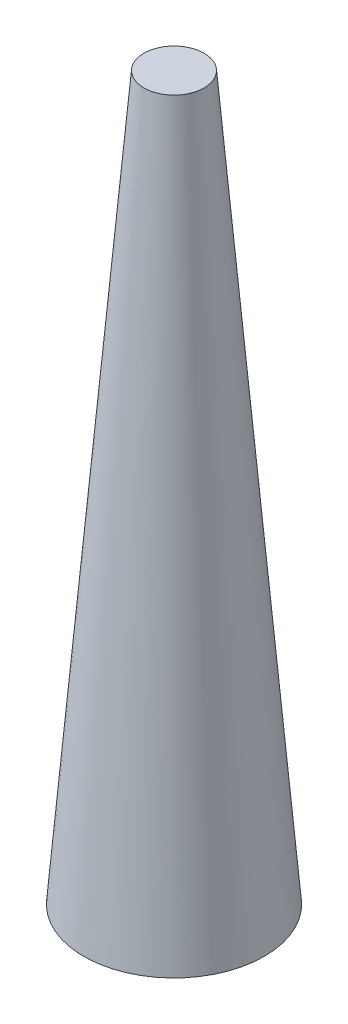
ISO-10303-21;
HEADER;
FILE_DESCRIPTION(('STEP AP214'),'2;1');
FILE_NAME('part.step','',(''),(''),'','','');
FILE_SCHEMA(('AUTOMOTIVE_DESIGN { 1 0 10303 214 1 1 1 1 }'));
ENDSEC;
DATA;
#1=APPLICATION_CONTEXT('core data for automotive mechanical design processes');
#2=APPLICATION_PROTOCOL_DEFINITION('international standard','automotive_design',2000,#1);
#3=PRODUCT_CONTEXT('',#1,'mechanical');
#4=PRODUCT('Part','Part','',(#3));
#5=PRODUCT_RELATED_PRODUCT_CATEGORY('part','',(#4));
#6=PRODUCT_DEFINITION_FORMATION('','',#4);
#7=PRODUCT_DEFINITION_CONTEXT('part definition',#1,'design');
#8=PRODUCT_DEFINITION('design','',#6,#7);
#9=PRODUCT_DEFINITION_SHAPE('','',#8);
#10=(LENGTH_UNIT() NAMED_UNIT(*) SI_UNIT(.MILLI.,.METRE.));
#11=(NAMED_UNIT(*) PLANE_ANGLE_UNIT() SI_UNIT($,.RADIAN.));
#12=(NAMED_UNIT(*) SI_UNIT($,.STERADIAN.) SOLID_ANGLE_UNIT());
#13=UNCERTAINTY_MEASURE_WITH_UNIT(LENGTH_MEASURE(1.E-05),#10,'distance_accuracy_value','');
#14=(GEOMETRIC_REPRESENTATION_CONTEXT(3) GLOBAL_UNCERTAINTY_ASSIGNED_CONTEXT((#13)) GLOBAL_UNIT_ASSIGNED_CONTEXT((#10,
#11,#12)) REPRESENTATION_CONTEXT('',''));
#15=CARTESIAN_POINT('',(0.,0.,0.));
#16=DIRECTION('',(0.,0.,1.));
#17=DIRECTION('',(1.,0.,0.));
#18=AXIS2_PLACEMENT_3D('',#15,#16,#17);
#19=CARTESIAN_POINT('',(0.,0.,0.));
#20=DIRECTION('',(0.,-1.,0.));
#21=DIRECTION('',(1.,0.,0.));
#22=AXIS2_PLACEMENT_3D('',#19,#20,#21);
#23=PLANE('',#22);
#24=CARTESIAN_POINT('',(0.,0.,0.));
#25=DIRECTION('',(0.,1.,0.));
#26=DIRECTION('',(-1.,0.,0.));
#27=AXIS2_PLACEMENT_3D('',#24,#25,#26);
#28=CIRCLE('',#27,19.05);
#29=CARTESIAN_POINT('',(19.05,0.,0.));
#30=VERTEX_POINT('',#29);
#31=EDGE_CURVE('E10',#30,#30,#28,.T.);
#32=ORIENTED_EDGE('',*,*,#31,.F.);
#33=EDGE_LOOP('',(#32));
#34=FACE_BOUND('',#33,.T.);
#35=ADVANCED_FACE('F43',(#34),#23,.T.);
#36=CARTESIAN_POINT('',(0.,152.4,0.));
#37=DIRECTION('',(0.,-1.,0.));
#38=DIRECTION('',(1.,0.,0.));
#39=AXIS2_PLACEMENT_3D('',#36,#37,#38);
#40=CONICAL_SURFACE('',#39,6.35,0.0831412318884412);
#41=CARTESIAN_POINT('',(0.,152.4,0.));
#42=DIRECTION('',(0.,1.,0.));
#43=DIRECTION('',(-1.,0.,0.));
#44=AXIS2_PLACEMENT_3D('',#41,#42,#43);
#45=CIRCLE('',#44,6.35);
#46=CARTESIAN_POINT('',(6.34999999999999,152.4,0.));
#47=VERTEX_POINT('',#46);
#48=EDGE_CURVE('E50',#47,#47,#45,.T.);
#49=CARTESIAN_POINT('',(19.05,0.,0.));
#50=CARTESIAN_POINT('',(18.9177083333333,1.58750000000003,0.));
#51=CARTESIAN_POINT('',(18.7854166666667,3.17500000000003,0.));
#52=CARTESIAN_POINT('',(18.5208333333333,6.35000000000003,0.));
#53=CARTESIAN_POINT('',(18.3885416666667,7.93750000000003,0.));
#54=CARTESIAN_POINT('',(18.1239583333333,11.1125,0.));
#55=CARTESIAN_POINT('',(17.9916666666667,12.7,0.));
#56=CARTESIAN_POINT('',(17.7270833333333,15.875,0.));
#57=CARTESIAN_POINT('',(17.5947916666667,17.4625,0.));
#58=CARTESIAN_POINT('',(17.3302083333333,20.6375,0.));
#59=CARTESIAN_POINT('',(17.1979166666667,22.225,0.));
#60=CARTESIAN_POINT('',(16.9333333333333,25.4,0.));
#61=CARTESIAN_POINT('',(16.8010416666667,26.9875,0.));
#62=CARTESIAN_POINT('',(16.5364583333333,30.1625,0.));
#63=CARTESIAN_POINT('',(16.4041666666667,31.75,0.));
#64=CARTESIAN_POINT('',(16.1395833333333,34.925,0.));
#65=CARTESIAN_POINT('',(16.0072916666667,36.5125,0.));
#66=CARTESIAN_POINT('',(15.7427083333333,39.6875,0.));
#67=CARTESIAN_POINT('',(15.6104166666667,41.275,0.));
#68=CARTESIAN_POINT('',(15.3458333333333,44.45,0.));
#69=CARTESIAN_POINT('',(15.2135416666667,46.0375,0.));
#70=CARTESIAN_POINT('',(14.9489583333333,49.2125,0.));
#71=CARTESIAN_POINT('',(14.8166666666667,50.8,0.));
#72=CARTESIAN_POINT('',(14.5520833333333,53.975,0.));
#73=CARTESIAN_POINT('',(14.4197916666667,55.5625,0.));
#74=CARTESIAN_POINT('',(14.1552083333333,58.7375,0.));
#75=CARTESIAN_POINT('',(14.0229166666667,60.325,0.));
#76=CARTESIAN_POINT('',(13.7583333333333,63.5,0.));
#77=CARTESIAN_POINT('',(13.6260416666667,65.0875,0.));
#78=CARTESIAN_POINT('',(13.3614583333333,68.2625,0.));
#79=CARTESIAN_POINT('',(13.2291666666667,69.85,0.));
#80=CARTESIAN_POINT('',(12.9645833333333,73.025,0.));
#81=CARTESIAN_POINT('',(12.8322916666667,74.6125,0.));
#82=CARTESIAN_POINT('',(12.5677083333333,77.7875,0.));
#83=CARTESIAN_POINT('',(12.4354166666667,79.375,0.));
#84=CARTESIAN_POINT('',(12.1708333333333,82.55,0.));
#85=CARTESIAN_POINT('',(12.0385416666667,84.1375,0.));
#86=CARTESIAN_POINT('',(11.7739583333333,87.3125,0.));
#87=CARTESIAN_POINT('',(11.6416666666667,88.9,0.));
#88=CARTESIAN_POINT('',(11.3770833333333,92.075,0.));
#89=CARTESIAN_POINT('',(11.2447916666667,93.6625,0.));
#90=CARTESIAN_POINT('',(10.9802083333333,96.8375,0.));
#91=CARTESIAN_POINT('',(10.8479166666667,98.425,0.));
#92=CARTESIAN_POINT('',(10.5833333333333,101.6,0.));
#93=CARTESIAN_POINT('',(10.4510416666667,103.1875,0.));
#94=CARTESIAN_POINT('',(10.1864583333333,106.3625,0.));
#95=CARTESIAN_POINT('',(10.0541666666667,107.95,0.));
#96=CARTESIAN_POINT('',(9.78958333333333,111.125,0.));
#97=CARTESIAN_POINT('',(9.65729166666666,112.7125,0.));
#98=CARTESIAN_POINT('',(9.39270833333333,115.8875,0.));
#99=CARTESIAN_POINT('',(9.26041666666666,117.475,0.));
#100=CARTESIAN_POINT('',(8.99583333333333,120.65,0.));
#101=CARTESIAN_POINT('',(8.86354166666666,122.2375,0.));
#102=CARTESIAN_POINT('',(8.59895833333333,125.4125,0.));
#103=CARTESIAN_POINT('',(8.46666666666666,127.,0.));
#104=CARTESIAN_POINT('',(8.20208333333333,130.175,0.));
#105=CARTESIAN_POINT('',(8.06979166666666,131.7625,0.));
#106=CARTESIAN_POINT('',(7.80520833333333,134.9375,0.));
#107=CARTESIAN_POINT('',(7.67291666666666,136.525,0.));
#108=CARTESIAN_POINT('',(7.40833333333333,139.7,0.));
#109=CARTESIAN_POINT('',(7.27604166666666,141.2875,0.));
#110=CARTESIAN_POINT('',(7.01145833333333,144.4625,0.));
#111=CARTESIAN_POINT('',(6.87916666666666,146.05,0.));
#112=CARTESIAN_POINT('',(6.61458333333333,149.225,0.));
#113=CARTESIAN_POINT('',(6.48229166666666,150.8125,0.));
#114=CARTESIAN_POINT('',(6.34999999999999,152.4,0.));
#115=B_SPLINE_CURVE_WITH_KNOTS('',3,(#49,#50,#51,#52,#53,#54,#55,#56,#57,#58,#59,#60,#61,#62,
#63,#64,#65,#66,#67,#68,#69,#70,#71,#72,#73,#74,#75,#76,#77,#78,#79,#80,#81,#82,#83,#84,#85,#86,
#87,#88,#89,#90,#91,#92,#93,#94,#95,#96,#97,#98,#99,#100,#101,#102,#103,#104,#105,#106,#107,
#108,#109,#110,#111,#112,#113,#114),.UNSPECIFIED.,.F.,.F.,(4,2,2,2,2,2,2,2,2,2,2,2,2,2,2,2,2,2,
2,2,2,2,2,2,2,2,2,2,2,2,2,2,4),(0.,4.7790078484582,9.55801569691639,14.3370235453746,
19.1160313938328,23.8950392422909,28.6740470907491,33.4530549392073,38.2320627876655,
43.0110706361237,47.7900784845819,52.5690863330401,57.3480941814983,62.1271020299565,
66.9061098784147,71.6851177268729,76.4641255753311,81.2431334237893,86.0221412722475,
90.8011491207056,95.5801569691638,100.359164817622,105.13817266608,109.917180514538,
114.696188362997,119.475196211455,124.254204059913,129.033211908371,133.812219756829,
138.591227605288,143.370235453746,148.149243302204,152.928251150662),.UNSPECIFIED.);
#116=EDGE_CURVE('BSEAM59',#30,#47,#115,.T.);
#117=ORIENTED_EDGE('',*,*,#31,.T.);
#118=ORIENTED_EDGE('',*,*,#48,.F.);
#119=ORIENTED_EDGE('',*,*,#116,.T.);
#120=ORIENTED_EDGE('',*,*,#116,.F.);
#121=EDGE_LOOP('',(#117,#119,#118,#120));
#122=FACE_BOUND('',#121,.T.);
#123=ADVANCED_FACE('F59',(#122),#40,.T.);
#124=CARTESIAN_POINT('',(-6.35000000000001,152.4,0.));
#125=DIRECTION('',(0.,1.,0.));
#126=DIRECTION('',(-1.,0.,0.));
#127=AXIS2_PLACEMENT_3D('',#124,#125,#126);
#128=PLANE('',#127);
#129=ORIENTED_EDGE('',*,*,#48,.T.);
#130=EDGE_LOOP('',(#129));
#131=FACE_BOUND('',#130,.T.);
#132=ADVANCED_FACE('F57',(#131),#128,.T.);
#133=CLOSED_SHELL('',(#35,#123,#132));
#134=MANIFOLD_SOLID_BREP('B2',#133);
#135=ADVANCED_BREP_SHAPE_REPRESENTATION('',(#18,#134),#14);
#136=SHAPE_DEFINITION_REPRESENTATION(#9,#135);
ENDSEC;
END-ISO-10303-21;
